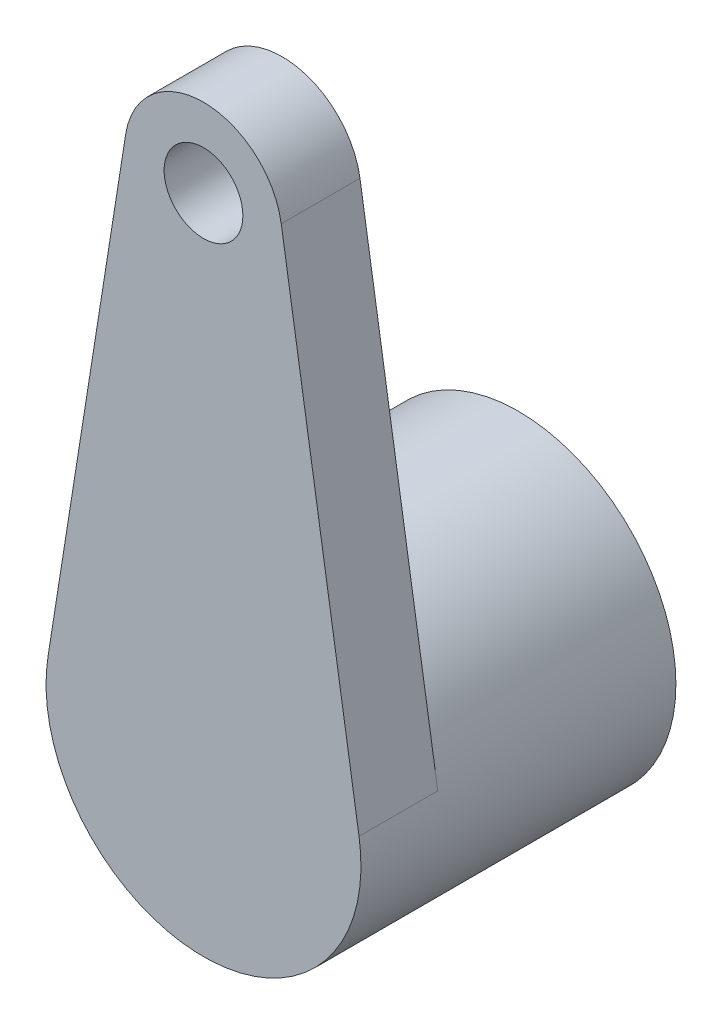
ISO-10303-21;
HEADER;
FILE_DESCRIPTION(('STEP AP214'),'2;1');
FILE_NAME('part.step','',(''),(''),'','','');
FILE_SCHEMA(('AUTOMOTIVE_DESIGN { 1 0 10303 214 1 1 1 1 }'));
ENDSEC;
DATA;
#1=APPLICATION_CONTEXT('core data for automotive mechanical design processes');
#2=APPLICATION_PROTOCOL_DEFINITION('international standard','automotive_design',2000,#1);
#3=PRODUCT_CONTEXT('',#1,'mechanical');
#4=PRODUCT('Part','Part','',(#3));
#5=PRODUCT_RELATED_PRODUCT_CATEGORY('part','',(#4));
#6=PRODUCT_DEFINITION_FORMATION('','',#4);
#7=PRODUCT_DEFINITION_CONTEXT('part definition',#1,'design');
#8=PRODUCT_DEFINITION('design','',#6,#7);
#9=PRODUCT_DEFINITION_SHAPE('','',#8);
#10=(LENGTH_UNIT() NAMED_UNIT(*) SI_UNIT(.MILLI.,.METRE.));
#11=(NAMED_UNIT(*) PLANE_ANGLE_UNIT() SI_UNIT($,.RADIAN.));
#12=(NAMED_UNIT(*) SI_UNIT($,.STERADIAN.) SOLID_ANGLE_UNIT());
#13=UNCERTAINTY_MEASURE_WITH_UNIT(LENGTH_MEASURE(1.E-05),#10,'distance_accuracy_value','');
#14=(GEOMETRIC_REPRESENTATION_CONTEXT(3) GLOBAL_UNCERTAINTY_ASSIGNED_CONTEXT((#13)) GLOBAL_UNIT_ASSIGNED_CONTEXT((#10,
#11,#12)) REPRESENTATION_CONTEXT('',''));
#15=CARTESIAN_POINT('',(0.,0.,0.));
#16=DIRECTION('',(0.,0.,1.));
#17=DIRECTION('',(1.,0.,0.));
#18=AXIS2_PLACEMENT_3D('',#15,#16,#17);
#19=CARTESIAN_POINT('',(14.6011978696653,-1.56419757761739,0.));
#20=DIRECTION('',(0.,0.,1.));
#21=DIRECTION('',(1.,0.,0.));
#22=AXIS2_PLACEMENT_3D('',#19,#20,#21);
#23=PLANE('',#22);
#24=CARTESIAN_POINT('',(14.6011978696653,-1.56419757761739,0.));
#25=DIRECTION('',(0.,0.,1.));
#26=DIRECTION('',(1.,0.,0.));
#27=AXIS2_PLACEMENT_3D('',#24,#25,#26);
#28=CIRCLE('',#27,3.175);
#29=CARTESIAN_POINT('',(17.7761978696653,-1.56419757761739,0.));
#30=VERTEX_POINT('',#29);
#31=EDGE_CURVE('E42',#30,#30,#28,.T.);
#32=ORIENTED_EDGE('',*,*,#31,.F.);
#33=EDGE_LOOP('',(#32));
#34=FACE_BOUND('',#33,.T.);
#35=CARTESIAN_POINT('',(14.6011978696653,-1.56419757761739,0.));
#36=DIRECTION('',(0.,0.,1.));
#37=DIRECTION('',(1.,0.,0.));
#38=AXIS2_PLACEMENT_3D('',#35,#36,#37);
#39=CIRCLE('',#38,1.58749999999999);
#40=CARTESIAN_POINT('',(13.0136978696653,-1.56419757761739,0.));
#41=VERTEX_POINT('',#40);
#42=EDGE_CURVE('E109',#41,#41,#39,.T.);
#43=ORIENTED_EDGE('',*,*,#42,.T.);
#44=EDGE_LOOP('',(#43));
#45=FACE_BOUND('',#44,.T.);
#46=ADVANCED_FACE('F33',(#34,#45),#23,.F.);
#47=CARTESIAN_POINT('',(14.6011978696653,-1.56419757761739,4.7625));
#48=DIRECTION('',(0.,0.,-1.));
#49=DIRECTION('',(-1.,0.,0.));
#50=AXIS2_PLACEMENT_3D('',#47,#48,#49);
#51=CYLINDRICAL_SURFACE('',#50,3.175);
#52=CARTESIAN_POINT('',(14.6011978696653,-1.56419757761739,4.7625));
#53=DIRECTION('',(0.,0.,1.));
#54=DIRECTION('',(1.,0.,0.));
#55=AXIS2_PLACEMENT_3D('',#52,#53,#54);
#56=CIRCLE('',#55,3.175);
#57=CARTESIAN_POINT('',(17.7372010765963,-1.06810395125359,4.7625));
#58=VERTEX_POINT('',#57);
#59=CARTESIAN_POINT('',(11.4651947018512,-1.0681037039812,4.7625));
#60=VERTEX_POINT('',#59);
#61=EDGE_CURVE('E11',#58,#60,#56,.T.);
#62=ORIENTED_EDGE('',*,*,#61,.F.);
#63=DIRECTION('',(0.,0.,-1.));
#64=VECTOR('',#63,1.);
#65=CARTESIAN_POINT('',(17.7372010765963,-1.06810395125359,6.35));
#66=LINE('',#65,#64);
#67=CARTESIAN_POINT('',(17.7372010765963,-1.06810395125359,6.35));
#68=VERTEX_POINT('',#67);
#69=EDGE_CURVE('E94',#68,#58,#66,.T.);
#70=ORIENTED_EDGE('',*,*,#69,.F.);
#71=CARTESIAN_POINT('',(14.6011978696653,-1.56419757761739,6.35));
#72=DIRECTION('',(0.,0.,1.));
#73=DIRECTION('',(1.,0.,0.));
#74=AXIS2_PLACEMENT_3D('',#71,#72,#73);
#75=CIRCLE('',#74,3.17499999999999);
#76=CARTESIAN_POINT('',(11.4651947018512,-1.06810370398119,6.35));
#77=VERTEX_POINT('',#76);
#78=EDGE_CURVE('E88',#77,#68,#75,.T.);
#79=ORIENTED_EDGE('',*,*,#78,.F.);
#80=DIRECTION('',(0.,0.,-1.));
#81=VECTOR('',#80,1.);
#82=CARTESIAN_POINT('',(11.4651947018512,-1.06810370398119,6.35));
#83=LINE('',#82,#81);
#84=EDGE_CURVE('E99',#77,#60,#83,.T.);
#85=ORIENTED_EDGE('',*,*,#84,.T.);
#86=EDGE_LOOP('',(#62,#70,#79,#85));
#87=FACE_BOUND('',#86,.T.);
#88=ORIENTED_EDGE('',*,*,#31,.T.);
#89=EDGE_LOOP('',(#88));
#90=FACE_BOUND('',#89,.T.);
#91=ADVANCED_FACE('F35',(#87,#90),#51,.T.);
#92=CARTESIAN_POINT('',(14.6011978696653,-1.56419757761739,4.7625));
#93=DIRECTION('',(0.,0.,-1.));
#94=DIRECTION('',(-1.,0.,0.));
#95=AXIS2_PLACEMENT_3D('',#92,#93,#94);
#96=CYLINDRICAL_SURFACE('',#95,1.58749999999999);
#97=CARTESIAN_POINT('',(14.6011978696653,-1.56419757761739,4.7625));
#98=DIRECTION('',(0.,0.,1.));
#99=DIRECTION('',(1.,0.,0.));
#100=AXIS2_PLACEMENT_3D('',#97,#98,#99);
#101=CIRCLE('',#100,1.58749999999999);
#102=CARTESIAN_POINT('',(13.0136978696653,-1.56419757761739,4.7625));
#103=VERTEX_POINT('',#102);
#104=EDGE_CURVE('E106',#103,#103,#101,.T.);
#105=CARTESIAN_POINT('',(13.0136978696653,-1.56419757761739,4.7625));
#106=CARTESIAN_POINT('',(13.0136978696653,-1.56419757761739,4.712890625));
#107=CARTESIAN_POINT('',(13.0136978696653,-1.56419757761739,4.66328125));
#108=CARTESIAN_POINT('',(13.0136978696653,-1.56419757761739,4.5640625));
#109=CARTESIAN_POINT('',(13.0136978696653,-1.56419757761739,4.514453125));
#110=CARTESIAN_POINT('',(13.0136978696653,-1.56419757761739,4.415234375));
#111=CARTESIAN_POINT('',(13.0136978696653,-1.56419757761739,4.365625));
#112=CARTESIAN_POINT('',(13.0136978696653,-1.56419757761739,4.26640625));
#113=CARTESIAN_POINT('',(13.0136978696653,-1.56419757761739,4.216796875));
#114=CARTESIAN_POINT('',(13.0136978696653,-1.56419757761739,4.117578125));
#115=CARTESIAN_POINT('',(13.0136978696653,-1.56419757761739,4.06796875));
#116=CARTESIAN_POINT('',(13.0136978696653,-1.56419757761739,3.96875));
#117=CARTESIAN_POINT('',(13.0136978696653,-1.56419757761739,3.919140625));
#118=CARTESIAN_POINT('',(13.0136978696653,-1.56419757761739,3.819921875));
#119=CARTESIAN_POINT('',(13.0136978696653,-1.56419757761739,3.7703125));
#120=CARTESIAN_POINT('',(13.0136978696653,-1.56419757761739,3.67109375));
#121=CARTESIAN_POINT('',(13.0136978696653,-1.56419757761739,3.621484375));
#122=CARTESIAN_POINT('',(13.0136978696653,-1.56419757761739,3.522265625));
#123=CARTESIAN_POINT('',(13.0136978696653,-1.56419757761739,3.47265625));
#124=CARTESIAN_POINT('',(13.0136978696653,-1.56419757761739,3.3734375));
#125=CARTESIAN_POINT('',(13.0136978696653,-1.56419757761739,3.323828125));
#126=CARTESIAN_POINT('',(13.0136978696653,-1.56419757761739,3.224609375));
#127=CARTESIAN_POINT('',(13.0136978696653,-1.56419757761739,3.175));
#128=CARTESIAN_POINT('',(13.0136978696653,-1.56419757761739,3.07578125));
#129=CARTESIAN_POINT('',(13.0136978696653,-1.56419757761739,3.026171875));
#130=CARTESIAN_POINT('',(13.0136978696653,-1.56419757761739,2.926953125));
#131=CARTESIAN_POINT('',(13.0136978696653,-1.56419757761739,2.87734375));
#132=CARTESIAN_POINT('',(13.0136978696653,-1.56419757761739,2.778125));
#133=CARTESIAN_POINT('',(13.0136978696653,-1.56419757761739,2.728515625));
#134=CARTESIAN_POINT('',(13.0136978696653,-1.56419757761739,2.629296875));
#135=CARTESIAN_POINT('',(13.0136978696653,-1.56419757761739,2.5796875));
#136=CARTESIAN_POINT('',(13.0136978696653,-1.56419757761739,2.48046875));
#137=CARTESIAN_POINT('',(13.0136978696653,-1.56419757761739,2.430859375));
#138=CARTESIAN_POINT('',(13.0136978696653,-1.56419757761739,2.331640625));
#139=CARTESIAN_POINT('',(13.0136978696653,-1.56419757761739,2.28203125));
#140=CARTESIAN_POINT('',(13.0136978696653,-1.56419757761739,2.1828125));
#141=CARTESIAN_POINT('',(13.0136978696653,-1.56419757761739,2.133203125));
#142=CARTESIAN_POINT('',(13.0136978696653,-1.56419757761739,2.033984375));
#143=CARTESIAN_POINT('',(13.0136978696653,-1.56419757761739,1.984375));
#144=CARTESIAN_POINT('',(13.0136978696653,-1.56419757761739,1.88515625));
#145=CARTESIAN_POINT('',(13.0136978696653,-1.56419757761739,1.835546875));
#146=CARTESIAN_POINT('',(13.0136978696653,-1.56419757761739,1.736328125));
#147=CARTESIAN_POINT('',(13.0136978696653,-1.56419757761739,1.68671875));
#148=CARTESIAN_POINT('',(13.0136978696653,-1.56419757761739,1.5875));
#149=CARTESIAN_POINT('',(13.0136978696653,-1.56419757761739,1.537890625));
#150=CARTESIAN_POINT('',(13.0136978696653,-1.56419757761739,1.438671875));
#151=CARTESIAN_POINT('',(13.0136978696653,-1.56419757761739,1.3890625));
#152=CARTESIAN_POINT('',(13.0136978696653,-1.56419757761739,1.28984375));
#153=CARTESIAN_POINT('',(13.0136978696653,-1.56419757761739,1.240234375));
#154=CARTESIAN_POINT('',(13.0136978696653,-1.56419757761739,1.141015625));
#155=CARTESIAN_POINT('',(13.0136978696653,-1.56419757761739,1.09140625));
#156=CARTESIAN_POINT('',(13.0136978696653,-1.56419757761739,0.992187499999999));
#157=CARTESIAN_POINT('',(13.0136978696653,-1.56419757761739,0.942578124999999));
#158=CARTESIAN_POINT('',(13.0136978696653,-1.56419757761739,0.843359375));
#159=CARTESIAN_POINT('',(13.0136978696653,-1.56419757761739,0.79375));
#160=CARTESIAN_POINT('',(13.0136978696653,-1.56419757761739,0.69453125));
#161=CARTESIAN_POINT('',(13.0136978696653,-1.56419757761739,0.644921875));
#162=CARTESIAN_POINT('',(13.0136978696653,-1.56419757761739,0.545703125));
#163=CARTESIAN_POINT('',(13.0136978696653,-1.56419757761739,0.49609375));
#164=CARTESIAN_POINT('',(13.0136978696653,-1.56419757761739,0.396875));
#165=CARTESIAN_POINT('',(13.0136978696653,-1.56419757761739,0.347265625));
#166=CARTESIAN_POINT('',(13.0136978696653,-1.56419757761739,0.248046875));
#167=CARTESIAN_POINT('',(13.0136978696653,-1.56419757761739,0.1984375));
#168=CARTESIAN_POINT('',(13.0136978696653,-1.56419757761739,0.09921875));
#169=CARTESIAN_POINT('',(13.0136978696653,-1.56419757761739,0.049609375));
#170=CARTESIAN_POINT('',(13.0136978696653,-1.56419757761739,0.));
#171=B_SPLINE_CURVE_WITH_KNOTS('',3,(#105,#106,#107,#108,#109,#110,#111,#112,#113,#114,#115,
#116,#117,#118,#119,#120,#121,#122,#123,#124,#125,#126,#127,#128,#129,#130,#131,#132,#133,#134,
#135,#136,#137,#138,#139,#140,#141,#142,#143,#144,#145,#146,#147,#148,#149,#150,#151,#152,#153,
#154,#155,#156,#157,#158,#159,#160,#161,#162,#163,#164,#165,#166,#167,#168,#169,#170),
.UNSPECIFIED.,.F.,.F.,(4,2,2,2,2,2,2,2,2,2,2,2,2,2,2,2,2,2,2,2,2,2,2,2,2,2,2,2,2,2,2,2,4),(0.,
0.148828125,0.29765625,0.446484375,0.5953125,0.744140625,0.892968750000001,1.041796875,1.190625,
1.339453125,1.48828125,1.637109375,1.7859375,1.934765625,2.08359375,2.232421875,2.38125,
2.530078125,2.67890625,2.827734375,2.9765625,3.125390625,3.27421875,3.423046875,3.571875,
3.720703125,3.86953125,4.018359375,4.1671875,4.316015625,4.46484375,4.613671875,4.7625),.UNSPECIFIED.);
#172=EDGE_CURVE('BSEAM140',#103,#41,#171,.T.);
#173=ORIENTED_EDGE('',*,*,#104,.T.);
#174=ORIENTED_EDGE('',*,*,#42,.F.);
#175=ORIENTED_EDGE('',*,*,#172,.T.);
#176=ORIENTED_EDGE('',*,*,#172,.F.);
#177=EDGE_LOOP('',(#173,#175,#174,#176));
#178=FACE_BOUND('',#177,.T.);
#179=ADVANCED_FACE('F140',(#178),#96,.F.);
#180=CARTESIAN_POINT('',(14.6011978696653,-1.56419757761739,4.7625));
#181=DIRECTION('',(0.,0.,1.));
#182=DIRECTION('',(1.,0.,0.));
#183=AXIS2_PLACEMENT_3D('',#180,#181,#182);
#184=PLANE('',#183);
#185=ORIENTED_EDGE('',*,*,#104,.F.);
#186=EDGE_LOOP('',(#185));
#187=FACE_BOUND('',#186,.T.);
#188=ADVANCED_FACE('F132',(#187),#184,.F.);
#189=CARTESIAN_POINT('',(14.601198270221,8.59580242238259,4.7625));
#190=DIRECTION('',(0.,0.,1.));
#191=DIRECTION('',(1.,0.,0.));
#192=AXIS2_PLACEMENT_3D('',#189,#190,#191);
#193=CIRCLE('',#192,0.793749999999999);
#194=CARTESIAN_POINT('',(15.394948270221,8.59580242238259,4.7625));
#195=VERTEX_POINT('',#194);
#196=EDGE_CURVE('E171',#195,#195,#193,.T.);
#197=ORIENTED_EDGE('',*,*,#196,.T.);
#198=EDGE_LOOP('',(#197));
#199=FACE_BOUND('',#198,.T.);
#200=DIRECTION('',(-0.156249961059464,0.987717545490064,0.));
#201=VECTOR('',#200,1.);
#202=CARTESIAN_POINT('',(17.7372010765963,-1.06810395125359,4.7625));
#203=LINE('',#202,#201);
#204=CARTESIAN_POINT('',(16.169199872905,8.8438492405043,4.7625));
#205=VERTEX_POINT('',#204);
#206=EDGE_CURVE('E93',#58,#205,#203,.T.);
#207=ORIENTED_EDGE('',*,*,#206,.F.);
#208=ORIENTED_EDGE('',*,*,#61,.T.);
#209=DIRECTION('',(-0.156250038940534,-0.987717533169824,0.));
#210=VECTOR('',#209,1.);
#211=CARTESIAN_POINT('',(11.4651947018512,-1.06810370398119,4.7625));
#212=LINE('',#211,#210);
#213=CARTESIAN_POINT('',(13.0331966863139,8.84384935920068,4.7625));
#214=VERTEX_POINT('',#213);
#215=EDGE_CURVE('E104',#214,#60,#212,.T.);
#216=ORIENTED_EDGE('',*,*,#215,.F.);
#217=CARTESIAN_POINT('',(14.601198270221,8.59580242238259,4.7625));
#218=DIRECTION('',(0.,0.,1.));
#219=DIRECTION('',(1.,0.,0.));
#220=AXIS2_PLACEMENT_3D('',#217,#218,#219);
#221=CIRCLE('',#220,1.5875);
#222=EDGE_CURVE('E74',#205,#214,#221,.T.);
#223=ORIENTED_EDGE('',*,*,#222,.F.);
#224=EDGE_LOOP('',(#207,#208,#216,#223));
#225=FACE_BOUND('',#224,.T.);
#226=ADVANCED_FACE('F130',(#199,#225),#184,.F.);
#227=CARTESIAN_POINT('',(14.6011978696653,-1.56419757761739,6.35));
#228=DIRECTION('',(0.,0.,1.));
#229=DIRECTION('',(1.,0.,0.));
#230=AXIS2_PLACEMENT_3D('',#227,#228,#229);
#231=PLANE('',#230);
#232=ORIENTED_EDGE('',*,*,#78,.T.);
#233=DIRECTION('',(-0.156249961059464,0.987717545490064,0.));
#234=VECTOR('',#233,1.);
#235=CARTESIAN_POINT('',(17.7372010765963,-1.06810395125359,6.35));
#236=LINE('',#235,#234);
#237=CARTESIAN_POINT('',(16.169199872905,8.8438492405043,6.35));
#238=VERTEX_POINT('',#237);
#239=EDGE_CURVE('E82',#68,#238,#236,.T.);
#240=ORIENTED_EDGE('',*,*,#239,.T.);
#241=CARTESIAN_POINT('',(14.601198270221,8.59580242238259,6.35));
#242=DIRECTION('',(0.,0.,1.));
#243=DIRECTION('',(1.,0.,0.));
#244=AXIS2_PLACEMENT_3D('',#241,#242,#243);
#245=CIRCLE('',#244,1.5875);
#246=CARTESIAN_POINT('',(13.0331966863139,8.84384935920068,6.35));
#247=VERTEX_POINT('',#246);
#248=EDGE_CURVE('E86',#238,#247,#245,.T.);
#249=ORIENTED_EDGE('',*,*,#248,.T.);
#250=DIRECTION('',(-0.156250038940534,-0.987717533169824,0.));
#251=VECTOR('',#250,1.);
#252=CARTESIAN_POINT('',(11.4651947018512,-1.06810370398119,6.35));
#253=LINE('',#252,#251);
#254=EDGE_CURVE('E57',#247,#77,#253,.T.);
#255=ORIENTED_EDGE('',*,*,#254,.T.);
#256=EDGE_LOOP('',(#232,#240,#249,#255));
#257=FACE_BOUND('',#256,.T.);
#258=CARTESIAN_POINT('',(14.601198270221,8.59580242238259,6.35));
#259=DIRECTION('',(0.,0.,1.));
#260=DIRECTION('',(1.,0.,0.));
#261=AXIS2_PLACEMENT_3D('',#258,#259,#260);
#262=CIRCLE('',#261,0.793749999999999);
#263=CARTESIAN_POINT('',(15.394948270221,8.59580242238259,6.35));
#264=VERTEX_POINT('',#263);
#265=EDGE_CURVE('E117',#264,#264,#262,.T.);
#266=ORIENTED_EDGE('',*,*,#265,.F.);
#267=EDGE_LOOP('',(#266));
#268=FACE_BOUND('',#267,.T.);
#269=ADVANCED_FACE('F83',(#257,#268),#231,.T.);
#270=CARTESIAN_POINT('',(17.7372010765963,-1.06810395125359,6.35));
#271=DIRECTION('',(-0.987717545490064,-0.156249961059464,0.));
#272=DIRECTION('',(0.156249961059464,-0.987717545490064,0.));
#273=AXIS2_PLACEMENT_3D('',#270,#271,#272);
#274=PLANE('',#273);
#275=ORIENTED_EDGE('',*,*,#206,.T.);
#276=DIRECTION('',(0.,0.,-1.));
#277=VECTOR('',#276,1.);
#278=CARTESIAN_POINT('',(16.169199872905,8.8438492405043,6.35));
#279=LINE('',#278,#277);
#280=EDGE_CURVE('E91',#238,#205,#279,.T.);
#281=ORIENTED_EDGE('',*,*,#280,.F.);
#282=ORIENTED_EDGE('',*,*,#239,.F.);
#283=ORIENTED_EDGE('',*,*,#69,.T.);
#284=EDGE_LOOP('',(#275,#281,#282,#283));
#285=FACE_BOUND('',#284,.T.);
#286=ADVANCED_FACE('F92',(#285),#274,.F.);
#287=CARTESIAN_POINT('',(14.601198270221,8.59580242238259,6.35));
#288=DIRECTION('',(0.,0.,-1.));
#289=DIRECTION('',(-1.,0.,0.));
#290=AXIS2_PLACEMENT_3D('',#287,#288,#289);
#291=CYLINDRICAL_SURFACE('',#290,1.5875);
#292=ORIENTED_EDGE('',*,*,#222,.T.);
#293=DIRECTION('',(0.,0.,-1.));
#294=VECTOR('',#293,1.);
#295=CARTESIAN_POINT('',(13.0331966863139,8.84384935920068,6.35));
#296=LINE('',#295,#294);
#297=EDGE_CURVE('E95',#247,#214,#296,.T.);
#298=ORIENTED_EDGE('',*,*,#297,.F.);
#299=ORIENTED_EDGE('',*,*,#248,.F.);
#300=ORIENTED_EDGE('',*,*,#280,.T.);
#301=EDGE_LOOP('',(#292,#298,#299,#300));
#302=FACE_BOUND('',#301,.T.);
#303=ADVANCED_FACE('F97',(#302),#291,.T.);
#304=CARTESIAN_POINT('',(11.4651947018512,-1.06810370398119,6.35));
#305=DIRECTION('',(0.987717533169824,-0.156250038940534,0.));
#306=DIRECTION('',(0.156250038940534,0.987717533169824,0.));
#307=AXIS2_PLACEMENT_3D('',#304,#305,#306);
#308=PLANE('',#307);
#309=ORIENTED_EDGE('',*,*,#215,.T.);
#310=ORIENTED_EDGE('',*,*,#84,.F.);
#311=ORIENTED_EDGE('',*,*,#254,.F.);
#312=ORIENTED_EDGE('',*,*,#297,.T.);
#313=EDGE_LOOP('',(#309,#310,#311,#312));
#314=FACE_BOUND('',#313,.T.);
#315=ADVANCED_FACE('F129',(#314),#308,.F.);
#316=CARTESIAN_POINT('',(14.601198270221,8.59580242238259,6.35));
#317=DIRECTION('',(0.,0.,-1.));
#318=DIRECTION('',(-1.,0.,0.));
#319=AXIS2_PLACEMENT_3D('',#316,#317,#318);
#320=CYLINDRICAL_SURFACE('',#319,0.793749999999999);
#321=ORIENTED_EDGE('',*,*,#265,.T.);
#322=EDGE_LOOP('',(#321));
#323=FACE_BOUND('',#322,.T.);
#324=ORIENTED_EDGE('',*,*,#196,.F.);
#325=EDGE_LOOP('',(#324));
#326=FACE_BOUND('',#325,.T.);
#327=ADVANCED_FACE('F159',(#323,#326),#320,.F.);
#328=CLOSED_SHELL('',(#46,#91,#179,#188,#226,#269,#286,#303,#315,#327));
#329=MANIFOLD_SOLID_BREP('B2',#328);
#330=ADVANCED_BREP_SHAPE_REPRESENTATION('',(#18,#329),#14);
#331=SHAPE_DEFINITION_REPRESENTATION(#9,#330);
ENDSEC;
END-ISO-10303-21;
